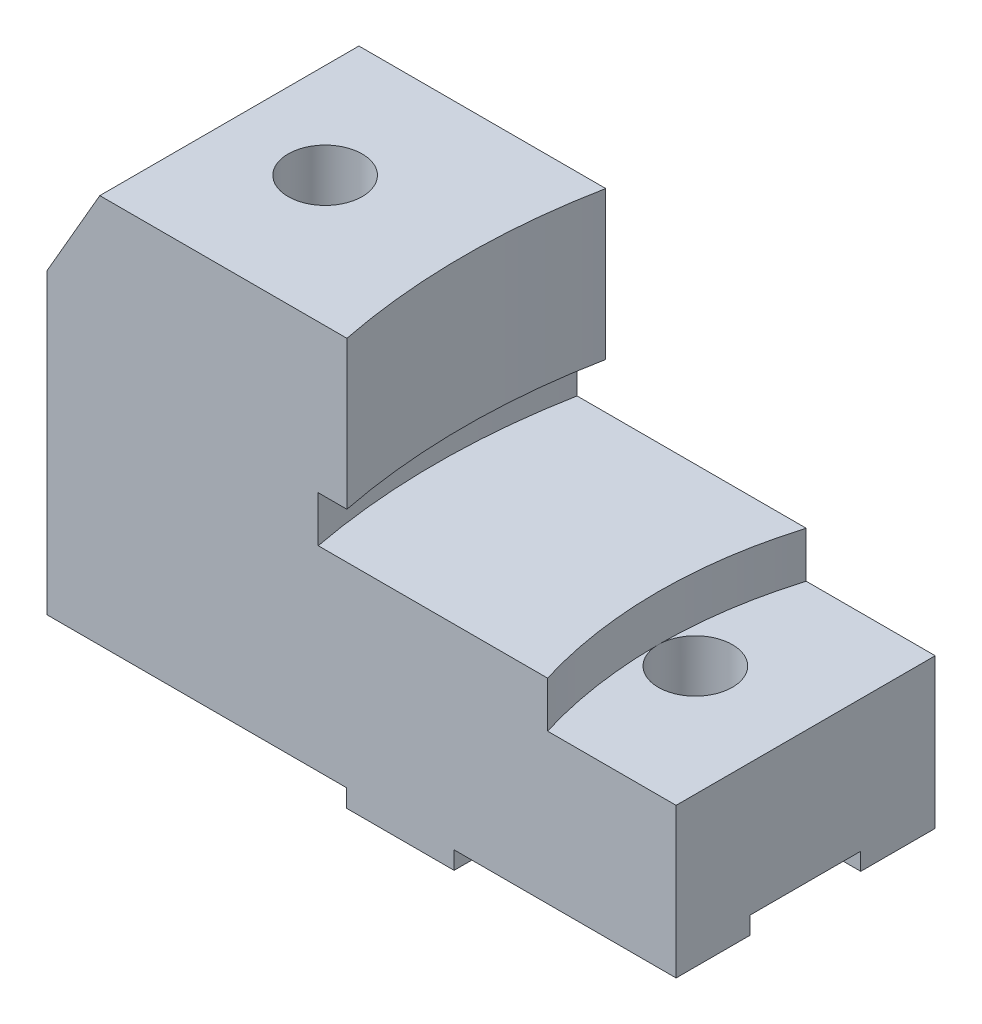
ISO-10303-21;
HEADER;
FILE_DESCRIPTION(('STEP AP214'),'2;1');
FILE_NAME('part.step','',(''),(''),'','','');
FILE_SCHEMA(('AUTOMOTIVE_DESIGN { 1 0 10303 214 1 1 1 1 }'));
ENDSEC;
DATA;
#1=APPLICATION_CONTEXT('core data for automotive mechanical design processes');
#2=APPLICATION_PROTOCOL_DEFINITION('international standard','automotive_design',2000,#1);
#3=PRODUCT_CONTEXT('',#1,'mechanical');
#4=PRODUCT('Part','Part','',(#3));
#5=PRODUCT_RELATED_PRODUCT_CATEGORY('part','',(#4));
#6=PRODUCT_DEFINITION_FORMATION('','',#4);
#7=PRODUCT_DEFINITION_CONTEXT('part definition',#1,'design');
#8=PRODUCT_DEFINITION('design','',#6,#7);
#9=PRODUCT_DEFINITION_SHAPE('','',#8);
#10=(LENGTH_UNIT() NAMED_UNIT(*) SI_UNIT(.MILLI.,.METRE.));
#11=(NAMED_UNIT(*) PLANE_ANGLE_UNIT() SI_UNIT($,.RADIAN.));
#12=(NAMED_UNIT(*) SI_UNIT($,.STERADIAN.) SOLID_ANGLE_UNIT());
#13=UNCERTAINTY_MEASURE_WITH_UNIT(LENGTH_MEASURE(1.E-05),#10,'distance_accuracy_value','');
#14=(GEOMETRIC_REPRESENTATION_CONTEXT(3) GLOBAL_UNCERTAINTY_ASSIGNED_CONTEXT((#13)) GLOBAL_UNIT_ASSIGNED_CONTEXT((#10,
#11,#12)) REPRESENTATION_CONTEXT('',''));
#15=CARTESIAN_POINT('',(0.,0.,0.));
#16=DIRECTION('',(0.,0.,1.));
#17=DIRECTION('',(1.,0.,0.));
#18=AXIS2_PLACEMENT_3D('',#15,#16,#17);
#19=CARTESIAN_POINT('',(56.5199901768173,69.85,-22.9236247544204));
#20=DIRECTION('',(-1.,0.,0.));
#21=DIRECTION('',(0.,0.,1.));
#22=AXIS2_PLACEMENT_3D('',#19,#20,#21);
#23=PLANE('',#22);
#24=DIRECTION('',(0.,0.,-1.));
#25=VECTOR('',#24,1.);
#26=CARTESIAN_POINT('',(56.5199901768173,28.702,-22.9236247544204));
#27=LINE('',#26,#25);
#28=CARTESIAN_POINT('',(56.5199901768173,28.702,21.5263752455796));
#29=VERTEX_POINT('',#28);
#30=CARTESIAN_POINT('',(56.5199901768173,28.702,-22.9236247544204));
#31=VERTEX_POINT('',#30);
#32=EDGE_CURVE('E368',#29,#31,#27,.T.);
#33=ORIENTED_EDGE('',*,*,#32,.F.);
#34=DIRECTION('',(0.,-1.,0.));
#35=VECTOR('',#34,1.);
#36=CARTESIAN_POINT('',(56.5199901768173,69.85,21.5263752455796));
#37=LINE('',#36,#35);
#38=CARTESIAN_POINT('',(56.5199901768173,3.05082524944031,21.5263752455796));
#39=VERTEX_POINT('',#38);
#40=EDGE_CURVE('E319',#29,#39,#37,.T.);
#41=ORIENTED_EDGE('',*,*,#40,.T.);
#42=DIRECTION('',(0.,0.,1.));
#43=VECTOR('',#42,1.);
#44=CARTESIAN_POINT('',(56.5199901768173,3.05082524944031,-22.9236247544204));
#45=LINE('',#44,#43);
#46=CARTESIAN_POINT('',(56.5199901768173,3.05082524944031,8.82637524557957));
#47=VERTEX_POINT('',#46);
#48=EDGE_CURVE('E334',#47,#39,#45,.T.);
#49=ORIENTED_EDGE('',*,*,#48,.F.);
#50=DIRECTION('',(0.,1.,0.));
#51=VECTOR('',#50,1.);
#52=CARTESIAN_POINT('',(56.5199901768173,0.,8.82637524557957));
#53=LINE('',#52,#51);
#54=CARTESIAN_POINT('',(56.5199901768173,6.04824164699943,8.82637524557957));
#55=VERTEX_POINT('',#54);
#56=EDGE_CURVE('E285',#47,#55,#53,.T.);
#57=ORIENTED_EDGE('',*,*,#56,.T.);
#58=DIRECTION('',(0.,0.,-1.));
#59=VECTOR('',#58,1.);
#60=CARTESIAN_POINT('',(56.5199901768173,6.04824164699943,8.82637524557957));
#61=LINE('',#60,#59);
#62=CARTESIAN_POINT('',(56.5199901768173,6.04824164699943,-10.1475782487439));
#63=VERTEX_POINT('',#62);
#64=EDGE_CURVE('E287',#55,#63,#61,.T.);
#65=ORIENTED_EDGE('',*,*,#64,.T.);
#66=DIRECTION('',(0.,-1.,0.));
#67=VECTOR('',#66,1.);
#68=CARTESIAN_POINT('',(56.5199901768173,6.04824164699943,-10.1475782487439));
#69=LINE('',#68,#67);
#70=CARTESIAN_POINT('',(56.5199901768173,3.05082524944031,-10.1475782487439));
#71=VERTEX_POINT('',#70);
#72=EDGE_CURVE('E290',#63,#71,#69,.T.);
#73=ORIENTED_EDGE('',*,*,#72,.T.);
#74=CARTESIAN_POINT('',(56.5199901768173,3.05082524944031,-22.9236247544204));
#75=VERTEX_POINT('',#74);
#76=EDGE_CURVE('E337',#75,#71,#45,.T.);
#77=ORIENTED_EDGE('',*,*,#76,.F.);
#78=DIRECTION('',(0.,-1.,0.));
#79=VECTOR('',#78,1.);
#80=CARTESIAN_POINT('',(56.5199901768173,69.85,-22.9236247544204));
#81=LINE('',#80,#79);
#82=EDGE_CURVE('E317',#31,#75,#81,.T.);
#83=ORIENTED_EDGE('',*,*,#82,.F.);
#84=EDGE_LOOP('',(#33,#41,#49,#57,#65,#73,#77,#83));
#85=FACE_BOUND('',#84,.T.);
#86=ADVANCED_FACE('F33',(#85),#23,.F.);
#87=CARTESIAN_POINT('',(0.,0.,0.));
#88=DIRECTION('',(0.,-1.,0.));
#89=DIRECTION('',(0.,0.,-1.));
#90=AXIS2_PLACEMENT_3D('',#87,#88,#89);
#91=PLANE('',#90);
#92=DIRECTION('',(1.,0.,0.));
#93=VECTOR('',#92,1.);
#94=CARTESIAN_POINT('',(0.,0.,8.82637524557957));
#95=LINE('',#94,#93);
#96=CARTESIAN_POINT('',(0.,0.,8.82637524557958));
#97=VERTEX_POINT('',#96);
#98=CARTESIAN_POINT('',(18.4398269486293,0.,8.82637524557958));
#99=VERTEX_POINT('',#98);
#100=EDGE_CURVE('E325',#97,#99,#95,.T.);
#101=ORIENTED_EDGE('',*,*,#100,.T.);
#102=DIRECTION('',(0.,0.,1.));
#103=VECTOR('',#102,1.);
#104=CARTESIAN_POINT('',(18.4398269486293,0.,-120.45962475442));
#105=LINE('',#104,#103);
#106=CARTESIAN_POINT('',(18.4398269486293,0.,21.5263752455796));
#107=VERTEX_POINT('',#106);
#108=EDGE_CURVE('E231',#99,#107,#105,.T.);
#109=ORIENTED_EDGE('',*,*,#108,.T.);
#110=DIRECTION('',(1.,0.,0.));
#111=VECTOR('',#110,1.);
#112=CARTESIAN_POINT('',(56.5199901768173,0.,21.5263752455796));
#113=LINE('',#112,#111);
#114=CARTESIAN_POINT('',(0.,0.,21.5263752455796));
#115=VERTEX_POINT('',#114);
#116=EDGE_CURVE('E305',#115,#107,#113,.T.);
#117=ORIENTED_EDGE('',*,*,#116,.F.);
#118=DIRECTION('',(0.,0.,1.));
#119=VECTOR('',#118,1.);
#120=CARTESIAN_POINT('',(0.,0.,-120.45962475442));
#121=LINE('',#120,#119);
#122=EDGE_CURVE('E264',#97,#115,#121,.T.);
#123=ORIENTED_EDGE('',*,*,#122,.F.);
#124=EDGE_LOOP('',(#101,#109,#117,#123));
#125=FACE_BOUND('',#124,.T.);
#126=ADVANCED_FACE('F420',(#125),#91,.T.);
#127=DIRECTION('',(-1.,0.,0.));
#128=VECTOR('',#127,1.);
#129=CARTESIAN_POINT('',(-51.4300098231827,0.,-22.9236247544204));
#130=LINE('',#129,#128);
#131=CARTESIAN_POINT('',(18.4398269486293,0.,-22.9236247544204));
#132=VERTEX_POINT('',#131);
#133=CARTESIAN_POINT('',(0.,0.,-22.9236247544204));
#134=VERTEX_POINT('',#133);
#135=EDGE_CURVE('E310',#132,#134,#130,.T.);
#136=ORIENTED_EDGE('',*,*,#135,.F.);
#137=CARTESIAN_POINT('',(18.4398269486293,0.,-10.1475782487439));
#138=VERTEX_POINT('',#137);
#139=EDGE_CURVE('E234',#132,#138,#105,.T.);
#140=ORIENTED_EDGE('',*,*,#139,.T.);
#141=DIRECTION('',(-1.,0.,0.));
#142=VECTOR('',#141,1.);
#143=CARTESIAN_POINT('',(0.,0.,-10.1475782487439));
#144=LINE('',#143,#142);
#145=CARTESIAN_POINT('',(0.,0.,-10.1475782487439));
#146=VERTEX_POINT('',#145);
#147=EDGE_CURVE('E323',#138,#146,#144,.T.);
#148=ORIENTED_EDGE('',*,*,#147,.T.);
#149=EDGE_CURVE('E266',#134,#146,#121,.T.);
#150=ORIENTED_EDGE('',*,*,#149,.F.);
#151=EDGE_LOOP('',(#136,#140,#148,#150));
#152=FACE_BOUND('',#151,.T.);
#153=ADVANCED_FACE('F456',(#152),#91,.T.);
#154=CARTESIAN_POINT('',(56.5199901768173,69.85,21.5263752455796));
#155=DIRECTION('',(0.,0.,-1.));
#156=DIRECTION('',(-1.,0.,0.));
#157=AXIS2_PLACEMENT_3D('',#154,#155,#156);
#158=PLANE('',#157);
#159=DIRECTION('',(1.,0.,0.));
#160=VECTOR('',#159,1.);
#161=CARTESIAN_POINT('',(56.5199901768173,28.702,21.5263752455796));
#162=LINE('',#161,#160);
#163=CARTESIAN_POINT('',(34.4720108225483,28.702,21.5263752455796));
#164=VERTEX_POINT('',#163);
#165=EDGE_CURVE('E213',#164,#29,#162,.T.);
#166=ORIENTED_EDGE('',*,*,#165,.F.);
#167=DIRECTION('',(0.,1.,0.));
#168=VECTOR('',#167,1.);
#169=CARTESIAN_POINT('',(34.4720108225483,28.702,21.5263752455796));
#170=LINE('',#169,#168);
#171=CARTESIAN_POINT('',(34.4720108225483,36.576,21.5263752455796));
#172=VERTEX_POINT('',#171);
#173=EDGE_CURVE('E212',#164,#172,#170,.T.);
#174=ORIENTED_EDGE('',*,*,#173,.T.);
#175=DIRECTION('',(1.,0.,0.));
#176=VECTOR('',#175,1.);
#177=CARTESIAN_POINT('',(56.5199901768173,36.576,21.5263752455796));
#178=LINE('',#177,#176);
#179=CARTESIAN_POINT('',(-4.86423147924146,36.576,21.5263752455796));
#180=VERTEX_POINT('',#179);
#181=EDGE_CURVE('E201',#180,#172,#178,.T.);
#182=ORIENTED_EDGE('',*,*,#181,.F.);
#183=DIRECTION('',(0.,-1.,0.));
#184=VECTOR('',#183,1.);
#185=CARTESIAN_POINT('',(-4.86423147924146,44.45,21.5263752455796));
#186=LINE('',#185,#184);
#187=CARTESIAN_POINT('',(-4.86423147924146,44.45,21.5263752455796));
#188=VERTEX_POINT('',#187);
#189=EDGE_CURVE('E385',#188,#180,#186,.T.);
#190=ORIENTED_EDGE('',*,*,#189,.F.);
#191=DIRECTION('',(1.,0.,0.));
#192=VECTOR('',#191,1.);
#193=CARTESIAN_POINT('',(56.5199901768173,44.45,21.5263752455796));
#194=LINE('',#193,#192);
#195=CARTESIAN_POINT('',(0.0528231415336394,44.45,21.5263752455796));
#196=VERTEX_POINT('',#195);
#197=EDGE_CURVE('E382',#188,#196,#194,.T.);
#198=ORIENTED_EDGE('',*,*,#197,.T.);
#199=DIRECTION('',(0.,1.,0.));
#200=VECTOR('',#199,1.);
#201=CARTESIAN_POINT('',(0.0528231415336394,36.576,21.5263752455796));
#202=LINE('',#201,#200);
#203=CARTESIAN_POINT('',(0.0528231415336394,69.85,21.5263752455796));
#204=VERTEX_POINT('',#203);
#205=EDGE_CURVE('E218',#196,#204,#202,.T.);
#206=ORIENTED_EDGE('',*,*,#205,.T.);
#207=DIRECTION('',(1.,0.,0.));
#208=VECTOR('',#207,1.);
#209=CARTESIAN_POINT('',(56.5199901768173,69.85,21.5263752455796));
#210=LINE('',#209,#208);
#211=CARTESIAN_POINT('',(-42.3378977839846,69.85,21.5263752455796));
#212=VERTEX_POINT('',#211);
#213=EDGE_CURVE('E306',#212,#204,#210,.T.);
#214=ORIENTED_EDGE('',*,*,#213,.F.);
#215=DIRECTION('',(0.499999999999995,0.866025403784442,0.));
#216=VECTOR('',#215,1.);
#217=CARTESIAN_POINT('',(-51.4300098231827,54.102,21.5263752455796));
#218=LINE('',#217,#216);
#219=CARTESIAN_POINT('',(-51.4300098231827,54.102,21.5263752455796));
#220=VERTEX_POINT('',#219);
#221=EDGE_CURVE('E220',#220,#212,#218,.T.);
#222=ORIENTED_EDGE('',*,*,#221,.F.);
#223=DIRECTION('',(0.,-1.,0.));
#224=VECTOR('',#223,1.);
#225=CARTESIAN_POINT('',(-51.4300098231827,69.85,21.5263752455796));
#226=LINE('',#225,#224);
#227=CARTESIAN_POINT('',(-51.4300098231827,3.05082524944031,21.5263752455796));
#228=VERTEX_POINT('',#227);
#229=EDGE_CURVE('E321',#220,#228,#226,.T.);
#230=ORIENTED_EDGE('',*,*,#229,.T.);
#231=DIRECTION('',(1.,0.,0.));
#232=VECTOR('',#231,1.);
#233=CARTESIAN_POINT('',(-51.4300098231827,3.05082524944031,21.5263752455796));
#234=LINE('',#233,#232);
#235=CARTESIAN_POINT('',(0.,3.0508252494403,21.5263752455796));
#236=VERTEX_POINT('',#235);
#237=EDGE_CURVE('E258',#228,#236,#234,.T.);
#238=ORIENTED_EDGE('',*,*,#237,.T.);
#239=DIRECTION('',(0.,-1.,0.));
#240=VECTOR('',#239,1.);
#241=CARTESIAN_POINT('',(0.,3.0508252494403,21.5263752455796));
#242=LINE('',#241,#240);
#243=EDGE_CURVE('E261',#236,#115,#242,.T.);
#244=ORIENTED_EDGE('',*,*,#243,.T.);
#245=ORIENTED_EDGE('',*,*,#116,.T.);
#246=DIRECTION('',(0.,1.,0.));
#247=VECTOR('',#246,1.);
#248=CARTESIAN_POINT('',(18.4398269486293,0.,21.5263752455796));
#249=LINE('',#248,#247);
#250=CARTESIAN_POINT('',(18.4398269486293,3.0508252494403,21.5263752455796));
#251=VERTEX_POINT('',#250);
#252=EDGE_CURVE('E241',#107,#251,#249,.T.);
#253=ORIENTED_EDGE('',*,*,#252,.T.);
#254=DIRECTION('',(1.,0.,0.));
#255=VECTOR('',#254,1.);
#256=CARTESIAN_POINT('',(18.4398269486293,3.0508252494403,21.5263752455796));
#257=LINE('',#256,#255);
#258=EDGE_CURVE('E238',#251,#39,#257,.T.);
#259=ORIENTED_EDGE('',*,*,#258,.T.);
#260=ORIENTED_EDGE('',*,*,#40,.F.);
#261=EDGE_LOOP('',(#166,#174,#182,#190,#198,#206,#214,#222,#230,#238,#244,#245,#253,#259,#260));
#262=FACE_BOUND('',#261,.T.);
#263=ADVANCED_FACE('F402',(#262),#158,.F.);
#264=CARTESIAN_POINT('',(-51.4300098231827,69.85,-22.9236247544204));
#265=DIRECTION('',(0.,0.,1.));
#266=DIRECTION('',(1.,0.,0.));
#267=AXIS2_PLACEMENT_3D('',#264,#265,#266);
#268=PLANE('',#267);
#269=DIRECTION('',(-1.,0.,0.));
#270=VECTOR('',#269,1.);
#271=CARTESIAN_POINT('',(-51.4300098231827,36.576,-22.9236247544204));
#272=LINE('',#271,#270);
#273=CARTESIAN_POINT('',(34.3945597975593,36.576,-22.9236247544204));
#274=VERTEX_POINT('',#273);
#275=CARTESIAN_POINT('',(-4.91246646771566,36.576,-22.9236247544204));
#276=VERTEX_POINT('',#275);
#277=EDGE_CURVE('E199',#274,#276,#272,.T.);
#278=ORIENTED_EDGE('',*,*,#277,.F.);
#279=DIRECTION('',(0.,1.,0.));
#280=VECTOR('',#279,1.);
#281=CARTESIAN_POINT('',(34.3945597975594,28.702,-22.9236247544204));
#282=LINE('',#281,#280);
#283=CARTESIAN_POINT('',(34.3945597975594,28.702,-22.9236247544204));
#284=VERTEX_POINT('',#283);
#285=EDGE_CURVE('E208',#274,#284,#282,.F.);
#286=ORIENTED_EDGE('',*,*,#285,.T.);
#287=DIRECTION('',(-1.,0.,0.));
#288=VECTOR('',#287,1.);
#289=CARTESIAN_POINT('',(-51.4300098231827,28.702,-22.9236247544204));
#290=LINE('',#289,#288);
#291=EDGE_CURVE('E365',#31,#284,#290,.T.);
#292=ORIENTED_EDGE('',*,*,#291,.F.);
#293=ORIENTED_EDGE('',*,*,#82,.T.);
#294=DIRECTION('',(1.,0.,0.));
#295=VECTOR('',#294,1.);
#296=CARTESIAN_POINT('',(-51.4300098231827,3.05082524944031,-22.9236247544204));
#297=LINE('',#296,#295);
#298=CARTESIAN_POINT('',(18.4398269486293,3.0508252494403,-22.9236247544204));
#299=VERTEX_POINT('',#298);
#300=EDGE_CURVE('E250',#299,#75,#297,.T.);
#301=ORIENTED_EDGE('',*,*,#300,.F.);
#302=DIRECTION('',(0.,1.,0.));
#303=VECTOR('',#302,1.);
#304=CARTESIAN_POINT('',(18.4398269486293,69.85,-22.9236247544204));
#305=LINE('',#304,#303);
#306=EDGE_CURVE('E256',#132,#299,#305,.T.);
#307=ORIENTED_EDGE('',*,*,#306,.F.);
#308=ORIENTED_EDGE('',*,*,#135,.T.);
#309=DIRECTION('',(0.,-1.,0.));
#310=VECTOR('',#309,1.);
#311=CARTESIAN_POINT('',(0.,69.85,-22.9236247544204));
#312=LINE('',#311,#310);
#313=CARTESIAN_POINT('',(0.,3.0508252494403,-22.9236247544204));
#314=VERTEX_POINT('',#313);
#315=EDGE_CURVE('E277',#314,#134,#312,.T.);
#316=ORIENTED_EDGE('',*,*,#315,.F.);
#317=DIRECTION('',(1.,0.,0.));
#318=VECTOR('',#317,1.);
#319=CARTESIAN_POINT('',(-51.4300098231827,3.05082524944031,-22.9236247544204));
#320=LINE('',#319,#318);
#321=CARTESIAN_POINT('',(-51.4300098231827,3.05082524944031,-22.9236247544204));
#322=VERTEX_POINT('',#321);
#323=EDGE_CURVE('E283',#322,#314,#320,.T.);
#324=ORIENTED_EDGE('',*,*,#323,.F.);
#325=DIRECTION('',(0.,-1.,0.));
#326=VECTOR('',#325,1.);
#327=CARTESIAN_POINT('',(-51.4300098231827,69.85,-22.9236247544204));
#328=LINE('',#327,#326);
#329=CARTESIAN_POINT('',(-51.4300098231827,54.102,-22.9236247544204));
#330=VERTEX_POINT('',#329);
#331=EDGE_CURVE('E312',#330,#322,#328,.T.);
#332=ORIENTED_EDGE('',*,*,#331,.F.);
#333=DIRECTION('',(0.499999999999995,0.866025403784442,0.));
#334=VECTOR('',#333,1.);
#335=CARTESIAN_POINT('',(-44.6109257937841,65.9130000000001,-22.9236247544204));
#336=LINE('',#335,#334);
#337=CARTESIAN_POINT('',(-42.3378977839846,69.85,-22.9236247544204));
#338=VERTEX_POINT('',#337);
#339=EDGE_CURVE('E228',#330,#338,#336,.T.);
#340=ORIENTED_EDGE('',*,*,#339,.T.);
#341=DIRECTION('',(-1.,0.,0.));
#342=VECTOR('',#341,1.);
#343=CARTESIAN_POINT('',(-51.4300098231827,69.85,-22.9236247544204));
#344=LINE('',#343,#342);
#345=CARTESIAN_POINT('',(0.00247321752087915,69.85,-22.9236247544204));
#346=VERTEX_POINT('',#345);
#347=EDGE_CURVE('E309',#346,#338,#344,.T.);
#348=ORIENTED_EDGE('',*,*,#347,.F.);
#349=DIRECTION('',(0.,1.,0.));
#350=VECTOR('',#349,1.);
#351=CARTESIAN_POINT('',(0.00247321752087915,36.576,-22.9236247544204));
#352=LINE('',#351,#350);
#353=CARTESIAN_POINT('',(0.00247321752087915,44.45,-22.9236247544204));
#354=VERTEX_POINT('',#353);
#355=EDGE_CURVE('E57',#346,#354,#352,.F.);
#356=ORIENTED_EDGE('',*,*,#355,.T.);
#357=DIRECTION('',(-1.,0.,0.));
#358=VECTOR('',#357,1.);
#359=CARTESIAN_POINT('',(-51.4300098231827,44.45,-22.9236247544204));
#360=LINE('',#359,#358);
#361=CARTESIAN_POINT('',(-4.91246646771566,44.45,-22.9236247544204));
#362=VERTEX_POINT('',#361);
#363=EDGE_CURVE('E379',#354,#362,#360,.T.);
#364=ORIENTED_EDGE('',*,*,#363,.T.);
#365=DIRECTION('',(0.,-1.,0.));
#366=VECTOR('',#365,1.);
#367=CARTESIAN_POINT('',(-4.91246646771566,44.45,-22.9236247544204));
#368=LINE('',#367,#366);
#369=EDGE_CURVE('E42',#276,#362,#368,.F.);
#370=ORIENTED_EDGE('',*,*,#369,.F.);
#371=EDGE_LOOP('',(#278,#286,#292,#293,#301,#307,#308,#316,#324,#332,#340,#348,#356,#364,#370));
#372=FACE_BOUND('',#371,.T.);
#373=ADVANCED_FACE('F216',(#372),#268,.F.);
#374=CARTESIAN_POINT('',(-85.4660098231828,0.,8.82637524557957));
#375=DIRECTION('',(0.,0.,-1.));
#376=DIRECTION('',(-1.,0.,0.));
#377=AXIS2_PLACEMENT_3D('',#374,#375,#376);
#378=PLANE('',#377);
#379=DIRECTION('',(-1.,0.,0.));
#380=VECTOR('',#379,1.);
#381=CARTESIAN_POINT('',(-85.4660098231828,3.05082524944029,8.82637524557957));
#382=LINE('',#381,#380);
#383=CARTESIAN_POINT('',(18.4398269486293,3.0508252494403,8.82637524557958));
#384=VERTEX_POINT('',#383);
#385=EDGE_CURVE('E247',#47,#384,#382,.T.);
#386=ORIENTED_EDGE('',*,*,#385,.T.);
#387=DIRECTION('',(0.,-1.,0.));
#388=VECTOR('',#387,1.);
#389=CARTESIAN_POINT('',(18.4398269486293,0.,8.82637524557957));
#390=LINE('',#389,#388);
#391=EDGE_CURVE('E253',#384,#99,#390,.T.);
#392=ORIENTED_EDGE('',*,*,#391,.T.);
#393=ORIENTED_EDGE('',*,*,#100,.F.);
#394=DIRECTION('',(0.,1.,0.));
#395=VECTOR('',#394,1.);
#396=CARTESIAN_POINT('',(0.,0.,8.82637524557957));
#397=LINE('',#396,#395);
#398=CARTESIAN_POINT('',(0.,3.0508252494403,8.82637524557957));
#399=VERTEX_POINT('',#398);
#400=EDGE_CURVE('E274',#97,#399,#397,.T.);
#401=ORIENTED_EDGE('',*,*,#400,.T.);
#402=DIRECTION('',(-1.,0.,0.));
#403=VECTOR('',#402,1.);
#404=CARTESIAN_POINT('',(-85.4660098231828,3.05082524944031,8.82637524557957));
#405=LINE('',#404,#403);
#406=CARTESIAN_POINT('',(-51.4300098231827,3.05082524944031,8.82637524557958));
#407=VERTEX_POINT('',#406);
#408=EDGE_CURVE('E280',#399,#407,#405,.T.);
#409=ORIENTED_EDGE('',*,*,#408,.T.);
#410=DIRECTION('',(0.,1.,0.));
#411=VECTOR('',#410,1.);
#412=CARTESIAN_POINT('',(-51.4300098231827,69.85,8.82637524557957));
#413=LINE('',#412,#411);
#414=CARTESIAN_POINT('',(-51.4300098231827,6.04824164699943,8.82637524557957));
#415=VERTEX_POINT('',#414);
#416=EDGE_CURVE('E301',#407,#415,#413,.T.);
#417=ORIENTED_EDGE('',*,*,#416,.T.);
#418=DIRECTION('',(1.,0.,0.));
#419=VECTOR('',#418,1.);
#420=CARTESIAN_POINT('',(-85.4660098231828,6.04824164699943,8.82637524557957));
#421=LINE('',#420,#419);
#422=EDGE_CURVE('E295',#415,#55,#421,.T.);
#423=ORIENTED_EDGE('',*,*,#422,.T.);
#424=ORIENTED_EDGE('',*,*,#56,.F.);
#425=EDGE_LOOP('',(#386,#392,#393,#401,#409,#417,#423,#424));
#426=FACE_BOUND('',#425,.T.);
#427=ADVANCED_FACE('F411',(#426),#378,.T.);
#428=CARTESIAN_POINT('',(-85.4660098231828,6.04824164699943,-10.1475782487439));
#429=DIRECTION('',(0.,0.,1.));
#430=DIRECTION('',(0.,-1.,0.));
#431=AXIS2_PLACEMENT_3D('',#428,#429,#430);
#432=PLANE('',#431);
#433=ORIENTED_EDGE('',*,*,#147,.F.);
#434=DIRECTION('',(0.,1.,0.));
#435=VECTOR('',#434,1.);
#436=CARTESIAN_POINT('',(18.4398269486293,6.04824164699943,-10.1475782487439));
#437=LINE('',#436,#435);
#438=CARTESIAN_POINT('',(18.4398269486293,3.0508252494403,-10.1475782487439));
#439=VERTEX_POINT('',#438);
#440=EDGE_CURVE('E338',#138,#439,#437,.T.);
#441=ORIENTED_EDGE('',*,*,#440,.T.);
#442=DIRECTION('',(1.,0.,0.));
#443=VECTOR('',#442,1.);
#444=CARTESIAN_POINT('',(-85.4660098231828,3.05082524944029,-10.1475782487439));
#445=LINE('',#444,#443);
#446=EDGE_CURVE('E244',#439,#71,#445,.T.);
#447=ORIENTED_EDGE('',*,*,#446,.T.);
#448=ORIENTED_EDGE('',*,*,#72,.F.);
#449=DIRECTION('',(1.,0.,0.));
#450=VECTOR('',#449,1.);
#451=CARTESIAN_POINT('',(-85.4660098231828,6.04824164699943,-10.1475782487439));
#452=LINE('',#451,#450);
#453=CARTESIAN_POINT('',(-51.4300098231827,6.04824164699943,-10.1475782487439));
#454=VERTEX_POINT('',#453);
#455=EDGE_CURVE('E293',#454,#63,#452,.T.);
#456=ORIENTED_EDGE('',*,*,#455,.F.);
#457=DIRECTION('',(0.,-1.,0.));
#458=VECTOR('',#457,1.);
#459=CARTESIAN_POINT('',(-51.4300098231827,69.85,-10.1475782487438));
#460=LINE('',#459,#458);
#461=CARTESIAN_POINT('',(-51.4300098231827,3.05082524944031,-10.1475782487439));
#462=VERTEX_POINT('',#461);
#463=EDGE_CURVE('E298',#454,#462,#460,.T.);
#464=ORIENTED_EDGE('',*,*,#463,.T.);
#465=DIRECTION('',(1.,0.,0.));
#466=VECTOR('',#465,1.);
#467=CARTESIAN_POINT('',(-85.4660098231828,3.05082524944031,-10.1475782487439));
#468=LINE('',#467,#466);
#469=CARTESIAN_POINT('',(0.,3.0508252494403,-10.1475782487439));
#470=VERTEX_POINT('',#469);
#471=EDGE_CURVE('E331',#462,#470,#468,.T.);
#472=ORIENTED_EDGE('',*,*,#471,.T.);
#473=DIRECTION('',(0.,-1.,0.));
#474=VECTOR('',#473,1.);
#475=CARTESIAN_POINT('',(0.,6.04824164699943,-10.1475782487439));
#476=LINE('',#475,#474);
#477=EDGE_CURVE('E328',#470,#146,#476,.T.);
#478=ORIENTED_EDGE('',*,*,#477,.T.);
#479=EDGE_LOOP('',(#433,#441,#447,#448,#456,#464,#472,#478));
#480=FACE_BOUND('',#479,.T.);
#481=ADVANCED_FACE('F441',(#480),#432,.T.);
#482=CARTESIAN_POINT('',(-51.4300098231827,69.85,-22.9236247544204));
#483=DIRECTION('',(1.,0.,0.));
#484=DIRECTION('',(0.,0.,-1.));
#485=AXIS2_PLACEMENT_3D('',#482,#483,#484);
#486=PLANE('',#485);
#487=ORIENTED_EDGE('',*,*,#229,.F.);
#488=DIRECTION('',(0.,0.,1.));
#489=VECTOR('',#488,1.);
#490=CARTESIAN_POINT('',(-51.4300098231827,54.102,-120.45962475442));
#491=LINE('',#490,#489);
#492=EDGE_CURVE('E226',#330,#220,#491,.T.);
#493=ORIENTED_EDGE('',*,*,#492,.F.);
#494=ORIENTED_EDGE('',*,*,#331,.T.);
#495=DIRECTION('',(0.,0.,1.));
#496=VECTOR('',#495,1.);
#497=CARTESIAN_POINT('',(-51.4300098231827,3.05082524944031,-120.45962475442));
#498=LINE('',#497,#496);
#499=EDGE_CURVE('E273',#322,#462,#498,.T.);
#500=ORIENTED_EDGE('',*,*,#499,.T.);
#501=ORIENTED_EDGE('',*,*,#463,.F.);
#502=DIRECTION('',(0.,0.,-1.));
#503=VECTOR('',#502,1.);
#504=CARTESIAN_POINT('',(-51.4300098231827,6.04824164699942,-22.9236247544204));
#505=LINE('',#504,#503);
#506=EDGE_CURVE('E303',#415,#454,#505,.T.);
#507=ORIENTED_EDGE('',*,*,#506,.F.);
#508=ORIENTED_EDGE('',*,*,#416,.F.);
#509=EDGE_CURVE('E270',#407,#228,#498,.T.);
#510=ORIENTED_EDGE('',*,*,#509,.T.);
#511=EDGE_LOOP('',(#487,#493,#494,#500,#501,#507,#508,#510));
#512=FACE_BOUND('',#511,.T.);
#513=ADVANCED_FACE('F35',(#512),#486,.F.);
#514=CARTESIAN_POINT('',(0.,69.85,0.));
#515=DIRECTION('',(0.,-1.,0.));
#516=DIRECTION('',(0.,0.,-1.));
#517=AXIS2_PLACEMENT_3D('',#514,#515,#516);
#518=PLANE('',#517);
#519=CARTESIAN_POINT('',(-26.0300098231827,69.85,-0.825624754420419));
#520=DIRECTION('',(0.,1.,0.));
#521=DIRECTION('',(0.,0.,1.));
#522=AXIS2_PLACEMENT_3D('',#519,#520,#521);
#523=CIRCLE('',#522,6.35);
#524=CARTESIAN_POINT('',(-26.0300098231827,69.85,5.52437524557958));
#525=VERTEX_POINT('',#524);
#526=EDGE_CURVE('E353',#525,#525,#523,.T.);
#527=ORIENTED_EDGE('',*,*,#526,.F.);
#528=EDGE_LOOP('',(#527));
#529=FACE_BOUND('',#528,.T.);
#530=ORIENTED_EDGE('',*,*,#213,.T.);
#531=CARTESIAN_POINT('',(112.145990176817,69.85,-0.825624754420433));
#532=DIRECTION('',(0.,1.,0.));
#533=DIRECTION('',(0.,0.,1.));
#534=AXIS2_PLACEMENT_3D('',#531,#532,#533);
#535=CIRCLE('',#534,114.3);
#536=EDGE_CURVE('E388',#346,#204,#535,.T.);
#537=ORIENTED_EDGE('',*,*,#536,.F.);
#538=ORIENTED_EDGE('',*,*,#347,.T.);
#539=DIRECTION('',(0.,0.,1.));
#540=VECTOR('',#539,1.);
#541=CARTESIAN_POINT('',(-42.3378977839846,69.85,0.));
#542=LINE('',#541,#540);
#543=EDGE_CURVE('E341',#338,#212,#542,.T.);
#544=ORIENTED_EDGE('',*,*,#543,.T.);
#545=EDGE_LOOP('',(#530,#537,#538,#544));
#546=FACE_BOUND('',#545,.T.);
#547=ADVANCED_FACE('F393',(#529,#546),#518,.F.);
#548=CARTESIAN_POINT('',(-85.4660098231828,6.04824164699943,8.82637524557957));
#549=DIRECTION('',(0.,-1.,0.));
#550=DIRECTION('',(0.,0.,-1.));
#551=AXIS2_PLACEMENT_3D('',#548,#549,#550);
#552=PLANE('',#551);
#553=CARTESIAN_POINT('',(-26.0300098231827,6.04824164699943,-0.825624754420426));
#554=DIRECTION('',(0.,-1.,0.));
#555=DIRECTION('',(0.,0.,-1.));
#556=AXIS2_PLACEMENT_3D('',#553,#554,#555);
#557=CIRCLE('',#556,4.826);
#558=CARTESIAN_POINT('',(-26.0300098231827,6.04824164699943,-5.65162475442043));
#559=VERTEX_POINT('',#558);
#560=EDGE_CURVE('E349',#559,#559,#557,.T.);
#561=ORIENTED_EDGE('',*,*,#560,.F.);
#562=EDGE_LOOP('',(#561));
#563=FACE_BOUND('',#562,.T.);
#564=CARTESIAN_POINT('',(37.4699901768173,6.04824164699943,-0.825624754420429));
#565=DIRECTION('',(0.,-1.,0.));
#566=DIRECTION('',(0.,0.,-1.));
#567=AXIS2_PLACEMENT_3D('',#564,#565,#566);
#568=CIRCLE('',#567,4.826);
#569=CARTESIAN_POINT('',(37.4699901768173,6.04824164699943,-5.65162475442043));
#570=VERTEX_POINT('',#569);
#571=EDGE_CURVE('E348',#570,#570,#568,.T.);
#572=ORIENTED_EDGE('',*,*,#571,.F.);
#573=EDGE_LOOP('',(#572));
#574=FACE_BOUND('',#573,.T.);
#575=ORIENTED_EDGE('',*,*,#506,.T.);
#576=ORIENTED_EDGE('',*,*,#455,.T.);
#577=ORIENTED_EDGE('',*,*,#64,.F.);
#578=ORIENTED_EDGE('',*,*,#422,.F.);
#579=EDGE_LOOP('',(#575,#576,#577,#578));
#580=FACE_BOUND('',#579,.T.);
#581=ADVANCED_FACE('F434',(#563,#574,#580),#552,.T.);
#582=CARTESIAN_POINT('',(0.,3.0508252494403,-120.45962475442));
#583=DIRECTION('',(-1.,0.,0.));
#584=DIRECTION('',(0.,-1.,0.));
#585=AXIS2_PLACEMENT_3D('',#582,#583,#584);
#586=PLANE('',#585);
#587=ORIENTED_EDGE('',*,*,#315,.T.);
#588=ORIENTED_EDGE('',*,*,#149,.T.);
#589=ORIENTED_EDGE('',*,*,#477,.F.);
#590=DIRECTION('',(0.,0.,1.));
#591=VECTOR('',#590,1.);
#592=CARTESIAN_POINT('',(0.,3.0508252494403,-120.45962475442));
#593=LINE('',#592,#591);
#594=EDGE_CURVE('E269',#314,#470,#593,.T.);
#595=ORIENTED_EDGE('',*,*,#594,.F.);
#596=EDGE_LOOP('',(#587,#588,#589,#595));
#597=FACE_BOUND('',#596,.T.);
#598=ADVANCED_FACE('F459',(#597),#586,.T.);
#599=CARTESIAN_POINT('',(-51.4300098231827,3.05082524944031,-120.45962475442));
#600=DIRECTION('',(0.,-1.,0.));
#601=DIRECTION('',(1.,0.,0.));
#602=AXIS2_PLACEMENT_3D('',#599,#600,#601);
#603=PLANE('',#602);
#604=ORIENTED_EDGE('',*,*,#323,.T.);
#605=ORIENTED_EDGE('',*,*,#594,.T.);
#606=ORIENTED_EDGE('',*,*,#471,.F.);
#607=ORIENTED_EDGE('',*,*,#499,.F.);
#608=EDGE_LOOP('',(#604,#605,#606,#607));
#609=FACE_BOUND('',#608,.T.);
#610=ADVANCED_FACE('F465',(#609),#603,.T.);
#611=EDGE_CURVE('E267',#399,#236,#593,.T.);
#612=ORIENTED_EDGE('',*,*,#611,.T.);
#613=ORIENTED_EDGE('',*,*,#237,.F.);
#614=ORIENTED_EDGE('',*,*,#509,.F.);
#615=ORIENTED_EDGE('',*,*,#408,.F.);
#616=EDGE_LOOP('',(#612,#613,#614,#615));
#617=FACE_BOUND('',#616,.T.);
#618=ADVANCED_FACE('F409',(#617),#603,.T.);
#619=ORIENTED_EDGE('',*,*,#122,.T.);
#620=ORIENTED_EDGE('',*,*,#243,.F.);
#621=ORIENTED_EDGE('',*,*,#611,.F.);
#622=ORIENTED_EDGE('',*,*,#400,.F.);
#623=EDGE_LOOP('',(#619,#620,#621,#622));
#624=FACE_BOUND('',#623,.T.);
#625=ADVANCED_FACE('F416',(#624),#586,.T.);
#626=CARTESIAN_POINT('',(18.4398269486293,3.0508252494403,-120.45962475442));
#627=DIRECTION('',(0.,-1.,0.));
#628=DIRECTION('',(1.,0.,0.));
#629=AXIS2_PLACEMENT_3D('',#626,#627,#628);
#630=PLANE('',#629);
#631=ORIENTED_EDGE('',*,*,#48,.T.);
#632=ORIENTED_EDGE('',*,*,#258,.F.);
#633=DIRECTION('',(0.,0.,1.));
#634=VECTOR('',#633,1.);
#635=CARTESIAN_POINT('',(18.4398269486293,3.0508252494403,-120.45962475442));
#636=LINE('',#635,#634);
#637=EDGE_CURVE('E235',#384,#251,#636,.T.);
#638=ORIENTED_EDGE('',*,*,#637,.F.);
#639=ORIENTED_EDGE('',*,*,#385,.F.);
#640=EDGE_LOOP('',(#631,#632,#638,#639));
#641=FACE_BOUND('',#640,.T.);
#642=ADVANCED_FACE('F427',(#641),#630,.T.);
#643=CARTESIAN_POINT('',(18.4398269486293,0.,-120.45962475442));
#644=DIRECTION('',(1.,0.,0.));
#645=DIRECTION('',(0.,0.,-1.));
#646=AXIS2_PLACEMENT_3D('',#643,#644,#645);
#647=PLANE('',#646);
#648=ORIENTED_EDGE('',*,*,#637,.T.);
#649=ORIENTED_EDGE('',*,*,#252,.F.);
#650=ORIENTED_EDGE('',*,*,#108,.F.);
#651=ORIENTED_EDGE('',*,*,#391,.F.);
#652=EDGE_LOOP('',(#648,#649,#650,#651));
#653=FACE_BOUND('',#652,.T.);
#654=ADVANCED_FACE('F424',(#653),#647,.T.);
#655=ORIENTED_EDGE('',*,*,#306,.T.);
#656=EDGE_CURVE('E237',#299,#439,#636,.T.);
#657=ORIENTED_EDGE('',*,*,#656,.T.);
#658=ORIENTED_EDGE('',*,*,#440,.F.);
#659=ORIENTED_EDGE('',*,*,#139,.F.);
#660=EDGE_LOOP('',(#655,#657,#658,#659));
#661=FACE_BOUND('',#660,.T.);
#662=ADVANCED_FACE('F449',(#661),#647,.T.);
#663=ORIENTED_EDGE('',*,*,#300,.T.);
#664=ORIENTED_EDGE('',*,*,#76,.T.);
#665=ORIENTED_EDGE('',*,*,#446,.F.);
#666=ORIENTED_EDGE('',*,*,#656,.F.);
#667=EDGE_LOOP('',(#663,#664,#665,#666));
#668=FACE_BOUND('',#667,.T.);
#669=ADVANCED_FACE('F446',(#668),#630,.T.);
#670=CARTESIAN_POINT('',(-51.4300098231827,54.102,-120.45962475442));
#671=DIRECTION('',(0.866025403784442,-0.499999999999995,0.));
#672=DIRECTION('',(0.499999999999995,0.866025403784442,0.));
#673=AXIS2_PLACEMENT_3D('',#670,#671,#672);
#674=PLANE('',#673);
#675=ORIENTED_EDGE('',*,*,#492,.T.);
#676=ORIENTED_EDGE('',*,*,#221,.T.);
#677=ORIENTED_EDGE('',*,*,#543,.F.);
#678=ORIENTED_EDGE('',*,*,#339,.F.);
#679=EDGE_LOOP('',(#675,#676,#677,#678));
#680=FACE_BOUND('',#679,.T.);
#681=ADVANCED_FACE('F396',(#680),#674,.F.);
#682=CARTESIAN_POINT('',(112.145990176817,36.576,-0.825624754420433));
#683=DIRECTION('',(0.,1.,0.));
#684=DIRECTION('',(0.,0.,1.));
#685=AXIS2_PLACEMENT_3D('',#682,#683,#684);
#686=PLANE('',#685);
#687=CARTESIAN_POINT('',(107.319990176817,36.576,-0.825624754420433));
#688=DIRECTION('',(0.,1.,0.));
#689=DIRECTION('',(0.,0.,1.));
#690=AXIS2_PLACEMENT_3D('',#687,#688,#689);
#691=CIRCLE('',#690,76.2);
#692=EDGE_CURVE('E194',#274,#172,#691,.T.);
#693=ORIENTED_EDGE('',*,*,#692,.F.);
#694=ORIENTED_EDGE('',*,*,#277,.T.);
#695=CARTESIAN_POINT('',(112.145990176817,36.576,-0.825624754420433));
#696=DIRECTION('',(0.,1.,0.));
#697=DIRECTION('',(0.,0.,1.));
#698=AXIS2_PLACEMENT_3D('',#695,#696,#697);
#699=CIRCLE('',#698,119.126);
#700=EDGE_CURVE('E375',#276,#180,#699,.T.);
#701=ORIENTED_EDGE('',*,*,#700,.T.);
#702=ORIENTED_EDGE('',*,*,#181,.T.);
#703=EDGE_LOOP('',(#693,#694,#701,#702));
#704=FACE_BOUND('',#703,.T.);
#705=ADVANCED_FACE('F196',(#704),#686,.T.);
#706=CARTESIAN_POINT('',(112.145990176817,36.576,-0.825624754420433));
#707=DIRECTION('',(0.,1.,0.));
#708=DIRECTION('',(0.,0.,1.));
#709=AXIS2_PLACEMENT_3D('',#706,#707,#708);
#710=CYLINDRICAL_SURFACE('',#709,114.3);
#711=ORIENTED_EDGE('',*,*,#205,.F.);
#712=CARTESIAN_POINT('',(112.145990176817,44.45,-0.825624754420433));
#713=DIRECTION('',(0.,1.,0.));
#714=DIRECTION('',(0.,0.,1.));
#715=AXIS2_PLACEMENT_3D('',#712,#713,#714);
#716=CIRCLE('',#715,114.3);
#717=EDGE_CURVE('E344',#196,#354,#716,.F.);
#718=ORIENTED_EDGE('',*,*,#717,.T.);
#719=ORIENTED_EDGE('',*,*,#355,.F.);
#720=ORIENTED_EDGE('',*,*,#536,.T.);
#721=EDGE_LOOP('',(#711,#718,#719,#720));
#722=FACE_BOUND('',#721,.T.);
#723=ADVANCED_FACE('F584',(#722),#710,.F.);
#724=CARTESIAN_POINT('',(112.145990176817,44.45,-0.825624754420433));
#725=DIRECTION('',(0.,-1.,0.));
#726=DIRECTION('',(0.,0.,-1.));
#727=AXIS2_PLACEMENT_3D('',#724,#725,#726);
#728=CYLINDRICAL_SURFACE('',#727,119.126);
#729=ORIENTED_EDGE('',*,*,#189,.T.);
#730=ORIENTED_EDGE('',*,*,#700,.F.);
#731=ORIENTED_EDGE('',*,*,#369,.T.);
#732=CARTESIAN_POINT('',(112.145990176817,44.45,-0.825624754420433));
#733=DIRECTION('',(0.,1.,0.));
#734=DIRECTION('',(0.,0.,1.));
#735=AXIS2_PLACEMENT_3D('',#732,#733,#734);
#736=CIRCLE('',#735,119.126);
#737=EDGE_CURVE('E376',#362,#188,#736,.T.);
#738=ORIENTED_EDGE('',*,*,#737,.T.);
#739=EDGE_LOOP('',(#729,#730,#731,#738));
#740=FACE_BOUND('',#739,.T.);
#741=ADVANCED_FACE('F592',(#740),#728,.F.);
#742=CARTESIAN_POINT('',(112.145990176817,44.45,-0.825624754420433));
#743=DIRECTION('',(0.,1.,0.));
#744=DIRECTION('',(0.,0.,1.));
#745=AXIS2_PLACEMENT_3D('',#742,#743,#744);
#746=PLANE('',#745);
#747=ORIENTED_EDGE('',*,*,#737,.F.);
#748=ORIENTED_EDGE('',*,*,#363,.F.);
#749=ORIENTED_EDGE('',*,*,#717,.F.);
#750=ORIENTED_EDGE('',*,*,#197,.F.);
#751=EDGE_LOOP('',(#747,#748,#749,#750));
#752=FACE_BOUND('',#751,.T.);
#753=ADVANCED_FACE('F599',(#752),#746,.F.);
#754=CARTESIAN_POINT('',(107.319990176817,28.702,-0.825624754420433));
#755=DIRECTION('',(0.,1.,0.));
#756=DIRECTION('',(0.,0.,1.));
#757=AXIS2_PLACEMENT_3D('',#754,#755,#756);
#758=CYLINDRICAL_SURFACE('',#757,76.2);
#759=CARTESIAN_POINT('',(107.319990176817,28.702,-0.825624754420433));
#760=DIRECTION('',(0.,1.,0.));
#761=DIRECTION('',(0.,0.,1.));
#762=AXIS2_PLACEMENT_3D('',#759,#760,#761);
#763=CIRCLE('',#762,76.2);
#764=CARTESIAN_POINT('',(31.1199901768173,28.702,-0.825624754420425));
#765=VERTEX_POINT('',#764);
#766=EDGE_CURVE('E204',#765,#164,#763,.T.);
#767=ORIENTED_EDGE('',*,*,#766,.F.);
#768=EDGE_CURVE('E49',#284,#765,#763,.T.);
#769=ORIENTED_EDGE('',*,*,#768,.F.);
#770=ORIENTED_EDGE('',*,*,#285,.F.);
#771=ORIENTED_EDGE('',*,*,#692,.T.);
#772=ORIENTED_EDGE('',*,*,#173,.F.);
#773=EDGE_LOOP('',(#767,#769,#770,#771,#772));
#774=FACE_BOUND('',#773,.T.);
#775=ADVANCED_FACE('F209',(#774),#758,.F.);
#776=CARTESIAN_POINT('',(107.319990176817,28.702,-0.825624754420433));
#777=DIRECTION('',(0.,1.,0.));
#778=DIRECTION('',(0.,0.,1.));
#779=AXIS2_PLACEMENT_3D('',#776,#777,#778);
#780=PLANE('',#779);
#781=ORIENTED_EDGE('',*,*,#165,.T.);
#782=ORIENTED_EDGE('',*,*,#32,.T.);
#783=ORIENTED_EDGE('',*,*,#291,.T.);
#784=ORIENTED_EDGE('',*,*,#768,.T.);
#785=CARTESIAN_POINT('',(37.4699901768173,28.702,-0.825624754420426));
#786=DIRECTION('',(0.,1.,0.));
#787=DIRECTION('',(0.,0.,1.));
#788=AXIS2_PLACEMENT_3D('',#785,#786,#787);
#789=CIRCLE('',#788,6.35);
#790=EDGE_CURVE('E11',#765,#765,#789,.F.);
#791=ORIENTED_EDGE('',*,*,#790,.T.);
#792=ORIENTED_EDGE('',*,*,#766,.T.);
#793=EDGE_LOOP('',(#781,#782,#783,#784,#791,#792));
#794=FACE_BOUND('',#793,.T.);
#795=ADVANCED_FACE('F613',(#794),#780,.T.);
#796=CARTESIAN_POINT('',(37.4699901768173,16.002,-0.825624754420426));
#797=DIRECTION('',(0.,1.,0.));
#798=DIRECTION('',(0.,0.,1.));
#799=AXIS2_PLACEMENT_3D('',#796,#797,#798);
#800=PLANE('',#799);
#801=CARTESIAN_POINT('',(37.4699901768173,16.002,-0.825624754420429));
#802=DIRECTION('',(0.,1.,0.));
#803=DIRECTION('',(0.,0.,1.));
#804=AXIS2_PLACEMENT_3D('',#801,#802,#803);
#805=CIRCLE('',#804,4.826);
#806=CARTESIAN_POINT('',(37.4699901768173,16.002,4.00037524557957));
#807=VERTEX_POINT('',#806);
#808=EDGE_CURVE('E346',#807,#807,#805,.T.);
#809=ORIENTED_EDGE('',*,*,#808,.F.);
#810=EDGE_LOOP('',(#809));
#811=FACE_BOUND('',#810,.T.);
#812=CARTESIAN_POINT('',(37.4699901768173,16.002,-0.825624754420426));
#813=DIRECTION('',(0.,1.,0.));
#814=DIRECTION('',(0.,0.,1.));
#815=AXIS2_PLACEMENT_3D('',#812,#813,#814);
#816=CIRCLE('',#815,6.35);
#817=CARTESIAN_POINT('',(37.4699901768173,16.002,5.52437524557958));
#818=VERTEX_POINT('',#817);
#819=EDGE_CURVE('E372',#818,#818,#816,.T.);
#820=ORIENTED_EDGE('',*,*,#819,.T.);
#821=EDGE_LOOP('',(#820));
#822=FACE_BOUND('',#821,.T.);
#823=ADVANCED_FACE('F620',(#811,#822),#800,.T.);
#824=CARTESIAN_POINT('',(37.4699901768173,16.002,-0.825624754420426));
#825=DIRECTION('',(0.,1.,0.));
#826=DIRECTION('',(0.,0.,1.));
#827=AXIS2_PLACEMENT_3D('',#824,#825,#826);
#828=CYLINDRICAL_SURFACE('',#827,6.35);
#829=ORIENTED_EDGE('',*,*,#819,.F.);
#830=EDGE_LOOP('',(#829));
#831=FACE_BOUND('',#830,.T.);
#832=ORIENTED_EDGE('',*,*,#790,.F.);
#833=EDGE_LOOP('',(#832));
#834=FACE_BOUND('',#833,.T.);
#835=ADVANCED_FACE('F626',(#831,#834),#828,.F.);
#836=CARTESIAN_POINT('',(-26.0300098231827,49.276,-0.825624754420419));
#837=DIRECTION('',(0.,1.,0.));
#838=DIRECTION('',(0.,0.,1.));
#839=AXIS2_PLACEMENT_3D('',#836,#837,#838);
#840=CYLINDRICAL_SURFACE('',#839,6.35);
#841=CARTESIAN_POINT('',(-26.0300098231827,49.276,-0.825624754420419));
#842=DIRECTION('',(0.,1.,0.));
#843=DIRECTION('',(0.,0.,1.));
#844=AXIS2_PLACEMENT_3D('',#841,#842,#843);
#845=CIRCLE('',#844,6.35);
#846=CARTESIAN_POINT('',(-26.0300098231827,49.276,5.52437524557958));
#847=VERTEX_POINT('',#846);
#848=EDGE_CURVE('E205',#847,#847,#845,.T.);
#849=ORIENTED_EDGE('',*,*,#848,.F.);
#850=EDGE_LOOP('',(#849));
#851=FACE_BOUND('',#850,.T.);
#852=ORIENTED_EDGE('',*,*,#526,.T.);
#853=EDGE_LOOP('',(#852));
#854=FACE_BOUND('',#853,.T.);
#855=ADVANCED_FACE('F634',(#851,#854),#840,.F.);
#856=CARTESIAN_POINT('',(-26.0300098231827,49.276,-0.825624754420419));
#857=DIRECTION('',(0.,1.,0.));
#858=DIRECTION('',(0.,0.,1.));
#859=AXIS2_PLACEMENT_3D('',#856,#857,#858);
#860=PLANE('',#859);
#861=CARTESIAN_POINT('',(-26.0300098231827,49.276,-0.825624754420426));
#862=DIRECTION('',(0.,1.,0.));
#863=DIRECTION('',(0.,0.,1.));
#864=AXIS2_PLACEMENT_3D('',#861,#862,#863);
#865=CIRCLE('',#864,4.826);
#866=CARTESIAN_POINT('',(-26.0300098231827,49.276,4.00037524557957));
#867=VERTEX_POINT('',#866);
#868=EDGE_CURVE('E37',#867,#867,#865,.T.);
#869=ORIENTED_EDGE('',*,*,#868,.F.);
#870=EDGE_LOOP('',(#869));
#871=FACE_BOUND('',#870,.T.);
#872=ORIENTED_EDGE('',*,*,#848,.T.);
#873=EDGE_LOOP('',(#872));
#874=FACE_BOUND('',#873,.T.);
#875=ADVANCED_FACE('F641',(#871,#874),#860,.T.);
#876=CARTESIAN_POINT('',(37.4699901768173,-11.43,-0.825624754420429));
#877=DIRECTION('',(0.,1.,0.));
#878=DIRECTION('',(0.,0.,1.));
#879=AXIS2_PLACEMENT_3D('',#876,#877,#878);
#880=CYLINDRICAL_SURFACE('',#879,4.826);
#881=ORIENTED_EDGE('',*,*,#571,.T.);
#882=EDGE_LOOP('',(#881));
#883=FACE_BOUND('',#882,.T.);
#884=ORIENTED_EDGE('',*,*,#808,.T.);
#885=EDGE_LOOP('',(#884));
#886=FACE_BOUND('',#885,.T.);
#887=ADVANCED_FACE('F648',(#883,#886),#880,.F.);
#888=CARTESIAN_POINT('',(-26.0300098231827,-11.43,-0.825624754420426));
#889=DIRECTION('',(0.,1.,0.));
#890=DIRECTION('',(0.,0.,1.));
#891=AXIS2_PLACEMENT_3D('',#888,#889,#890);
#892=CYLINDRICAL_SURFACE('',#891,4.826);
#893=ORIENTED_EDGE('',*,*,#560,.T.);
#894=EDGE_LOOP('',(#893));
#895=FACE_BOUND('',#894,.T.);
#896=ORIENTED_EDGE('',*,*,#868,.T.);
#897=EDGE_LOOP('',(#896));
#898=FACE_BOUND('',#897,.T.);
#899=ADVANCED_FACE('F656',(#895,#898),#892,.F.);
#900=CLOSED_SHELL('',(#86,#126,#153,#263,#373,#427,#481,#513,#547,#581,#598,#610,#618,#625,#642,
#654,#662,#669,#681,#705,#723,#741,#753,#775,#795,#823,#835,#855,#875,#887,#899));
#901=MANIFOLD_SOLID_BREP('B2',#900);
#902=ADVANCED_BREP_SHAPE_REPRESENTATION('',(#18,#901),#14);
#903=SHAPE_DEFINITION_REPRESENTATION(#9,#902);
ENDSEC;
END-ISO-10303-21;
